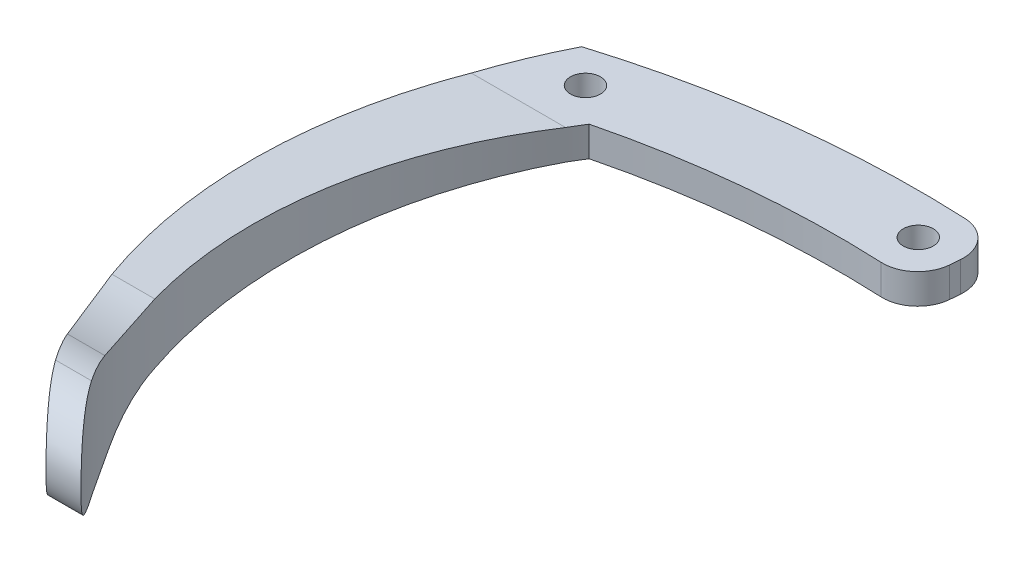
ISO-10303-21;
HEADER;
FILE_DESCRIPTION(('STEP AP214'),'2;1');
FILE_NAME('part.step','',(''),(''),'','','');
FILE_SCHEMA(('AUTOMOTIVE_DESIGN { 1 0 10303 214 1 1 1 1 }'));
ENDSEC;
DATA;
#1=APPLICATION_CONTEXT('core data for automotive mechanical design processes');
#2=APPLICATION_PROTOCOL_DEFINITION('international standard','automotive_design',2000,#1);
#3=PRODUCT_CONTEXT('',#1,'mechanical');
#4=PRODUCT('Part','Part','',(#3));
#5=PRODUCT_RELATED_PRODUCT_CATEGORY('part','',(#4));
#6=PRODUCT_DEFINITION_FORMATION('','',#4);
#7=PRODUCT_DEFINITION_CONTEXT('part definition',#1,'design');
#8=PRODUCT_DEFINITION('design','',#6,#7);
#9=PRODUCT_DEFINITION_SHAPE('','',#8);
#10=(LENGTH_UNIT() NAMED_UNIT(*) SI_UNIT(.MILLI.,.METRE.));
#11=(NAMED_UNIT(*) PLANE_ANGLE_UNIT() SI_UNIT($,.RADIAN.));
#12=(NAMED_UNIT(*) SI_UNIT($,.STERADIAN.) SOLID_ANGLE_UNIT());
#13=UNCERTAINTY_MEASURE_WITH_UNIT(LENGTH_MEASURE(1.E-05),#10,'distance_accuracy_value','');
#14=(GEOMETRIC_REPRESENTATION_CONTEXT(3) GLOBAL_UNCERTAINTY_ASSIGNED_CONTEXT((#13)) GLOBAL_UNIT_ASSIGNED_CONTEXT((#10,
#11,#12)) REPRESENTATION_CONTEXT('',''));
#15=CARTESIAN_POINT('',(0.,0.,0.));
#16=DIRECTION('',(0.,0.,1.));
#17=DIRECTION('',(1.,0.,0.));
#18=AXIS2_PLACEMENT_3D('',#15,#16,#17);
#19=CARTESIAN_POINT('',(33.3380804479992,10.,-0.314138112885189));
#20=DIRECTION('',(0.,-1.,0.));
#21=DIRECTION('',(0.,0.,-1.));
#22=AXIS2_PLACEMENT_3D('',#19,#20,#21);
#23=CYLINDRICAL_SURFACE('',#22,1.5);
#24=CARTESIAN_POINT('',(33.3380804479992,3.5,-0.314138112885189));
#25=DIRECTION('',(0.,1.,0.));
#26=DIRECTION('',(0.,0.,1.));
#27=AXIS2_PLACEMENT_3D('',#24,#25,#26);
#28=CIRCLE('',#27,1.5);
#29=CARTESIAN_POINT('',(33.3380804479992,3.5,1.18586188711481));
#30=VERTEX_POINT('',#29);
#31=EDGE_CURVE('E181',#30,#30,#28,.T.);
#32=ORIENTED_EDGE('',*,*,#31,.F.);
#33=EDGE_LOOP('',(#32));
#34=FACE_BOUND('',#33,.T.);
#35=CARTESIAN_POINT('',(33.3380804479992,6.5,-0.314138112885189));
#36=DIRECTION('',(0.,-1.,0.));
#37=DIRECTION('',(0.,0.,-1.));
#38=AXIS2_PLACEMENT_3D('',#35,#36,#37);
#39=CIRCLE('',#38,1.5);
#40=CARTESIAN_POINT('',(33.3380804479992,6.5,-1.81413811288519));
#41=VERTEX_POINT('',#40);
#42=EDGE_CURVE('E207',#41,#41,#39,.T.);
#43=ORIENTED_EDGE('',*,*,#42,.F.);
#44=EDGE_LOOP('',(#43));
#45=FACE_BOUND('',#44,.T.);
#46=ADVANCED_FACE('F43',(#34,#45),#23,.F.);
#47=CARTESIAN_POINT('',(-5.96136161269949,6.5,7.80214190070247));
#48=DIRECTION('',(0.,-1.,0.));
#49=DIRECTION('',(0.,0.,-1.));
#50=AXIS2_PLACEMENT_3D('',#47,#48,#49);
#51=PLANE('',#50);
#52=CARTESIAN_POINT('',(3.54066834664426,6.5,3.16641242719128));
#53=DIRECTION('',(0.,-1.,0.));
#54=DIRECTION('',(0.,0.,-1.));
#55=AXIS2_PLACEMENT_3D('',#52,#53,#54);
#56=CIRCLE('',#55,1.49999999999998);
#57=CARTESIAN_POINT('',(3.54066834664426,6.5,1.6664124271913));
#58=VERTEX_POINT('',#57);
#59=EDGE_CURVE('E202',#58,#58,#56,.T.);
#60=ORIENTED_EDGE('',*,*,#59,.T.);
#61=EDGE_LOOP('',(#60));
#62=FACE_BOUND('',#61,.T.);
#63=ORIENTED_EDGE('',*,*,#42,.T.);
#64=EDGE_LOOP('',(#63));
#65=FACE_BOUND('',#64,.T.);
#66=DIRECTION('',(1.,0.,0.));
#67=VECTOR('',#66,1.);
#68=CARTESIAN_POINT('',(-5.96136161269949,6.5,7.80214190070247));
#69=LINE('',#68,#67);
#70=CARTESIAN_POINT('',(-3.23491683360743,6.5,7.80214190070247));
#71=VERTEX_POINT('',#70);
#72=CARTESIAN_POINT('',(6.18628796721559,6.5,7.80214190070247));
#73=VERTEX_POINT('',#72);
#74=EDGE_CURVE('E176',#71,#73,#69,.T.);
#75=ORIENTED_EDGE('',*,*,#74,.T.);
#76=CARTESIAN_POINT('',(45.9119770796478,6.5,30.9941582973503));
#77=DIRECTION('',(0.,-1.,0.));
#78=DIRECTION('',(0.,0.,-1.));
#79=AXIS2_PLACEMENT_3D('',#76,#77,#78);
#80=CIRCLE('',#79,46.);
#81=CARTESIAN_POINT('',(7.08133669328854,6.5,6.33282485438257));
#82=VERTEX_POINT('',#81);
#83=EDGE_CURVE('E222',#82,#73,#80,.F.);
#84=ORIENTED_EDGE('',*,*,#83,.F.);
#85=CARTESIAN_POINT('',(29.3296857125669,6.5,95.6021419007025));
#86=DIRECTION('',(0.,-1.,0.));
#87=DIRECTION('',(0.,0.,-1.));
#88=AXIS2_PLACEMENT_3D('',#85,#86,#87);
#89=CIRCLE('',#88,92.);
#90=CARTESIAN_POINT('',(33.6351208335778,6.5,3.70294044378679));
#91=VERTEX_POINT('',#90);
#92=EDGE_CURVE('E218',#91,#82,#89,.F.);
#93=ORIENTED_EDGE('',*,*,#92,.F.);
#94=CARTESIAN_POINT('',(33.7989145610076,6.5,0.206775170969333));
#95=DIRECTION('',(0.,-1.,0.));
#96=DIRECTION('',(0.,0.,-1.));
#97=AXIS2_PLACEMENT_3D('',#94,#95,#96);
#98=CIRCLE('',#97,3.50000000000002);
#99=CARTESIAN_POINT('',(37.2867281700922,6.5,0.498590572010491));
#100=VERTEX_POINT('',#99);
#101=EDGE_CURVE('E214',#100,#91,#98,.T.);
#102=ORIENTED_EDGE('',*,*,#101,.F.);
#103=DIRECTION('',(-0.0833758288689002,0.,0.996518174024149));
#104=VECTOR('',#103,1.);
#105=CARTESIAN_POINT('',(37.3701594677668,6.5,-0.49859057201049));
#106=LINE('',#105,#104);
#107=CARTESIAN_POINT('',(37.3701594677668,6.5,-0.498590572010492));
#108=VERTEX_POINT('',#107);
#109=EDGE_CURVE('E210',#108,#100,#106,.T.);
#110=ORIENTED_EDGE('',*,*,#109,.F.);
#111=CARTESIAN_POINT('',(33.8823458586823,6.5,-0.79040597305165));
#112=DIRECTION('',(0.,-1.,0.));
#113=DIRECTION('',(0.,0.,-1.));
#114=AXIS2_PLACEMENT_3D('',#111,#112,#113);
#115=CIRCLE('',#114,3.49999999999999);
#116=CARTESIAN_POINT('',(34.0474682474015,6.5,-4.28650874567485));
#117=VERTEX_POINT('',#116);
#118=EDGE_CURVE('E206',#117,#108,#115,.T.);
#119=ORIENTED_EDGE('',*,*,#118,.F.);
#120=CARTESIAN_POINT('',(29.3296857125669,6.5,95.6021419007025));
#121=DIRECTION('',(0.,-1.,0.));
#122=DIRECTION('',(0.,0.,-1.));
#123=AXIS2_PLACEMENT_3D('',#120,#121,#122);
#124=CIRCLE('',#123,100.);
#125=CARTESIAN_POINT('',(0.,6.5,0.));
#126=VERTEX_POINT('',#125);
#127=EDGE_CURVE('E179',#126,#117,#124,.T.);
#128=ORIENTED_EDGE('',*,*,#127,.F.);
#129=CARTESIAN_POINT('',(49.0386383873005,6.5,24.9040547927356));
#130=DIRECTION('',(0.,-1.,0.));
#131=DIRECTION('',(0.,0.,-1.));
#132=AXIS2_PLACEMENT_3D('',#129,#130,#131);
#133=CIRCLE('',#132,55.);
#134=EDGE_CURVE('E163',#71,#126,#133,.T.);
#135=ORIENTED_EDGE('',*,*,#134,.F.);
#136=EDGE_LOOP('',(#75,#84,#93,#102,#110,#119,#128,#135));
#137=FACE_BOUND('',#136,.T.);
#138=ADVANCED_FACE('F175',(#62,#65,#137),#51,.F.);
#139=CARTESIAN_POINT('',(-5.96136161269949,32.9925159320674,45.29812586478));
#140=DIRECTION('',(1.,0.,0.));
#141=DIRECTION('',(0.,0.,-1.));
#142=AXIS2_PLACEMENT_3D('',#139,#140,#141);
#143=CYLINDRICAL_SURFACE('',#142,25.);
#144=DIRECTION('',(1.,0.,0.));
#145=VECTOR('',#144,1.);
#146=CARTESIAN_POINT('',(-5.96136161269949,9.35424864023339,53.4364499821773));
#147=LINE('',#146,#145);
#148=CARTESIAN_POINT('',(2.01840418165747,9.35424864023339,53.4364499821773));
#149=VERTEX_POINT('',#148);
#150=CARTESIAN_POINT('',(5.75797922223464,9.35424864023339,53.4364499821773));
#151=VERTEX_POINT('',#150);
#152=EDGE_CURVE('E195',#149,#151,#147,.T.);
#153=ORIENTED_EDGE('',*,*,#152,.T.);
#154=CARTESIAN_POINT('',(1.99704626542913,8.,44.6864499821773));
#155=CARTESIAN_POINT('',(2.11757982798963,7.99052733498026,45.0730833641365));
#156=CARTESIAN_POINT('',(2.24330110848355,7.99008647917682,45.4582900756178));
#157=CARTESIAN_POINT('',(2.50472598763776,8.00676018393478,46.2248564764888));
#158=CARTESIAN_POINT('',(2.64042807222505,8.02387208684709,46.606216739439));
#159=CARTESIAN_POINT('',(2.92022986019323,8.07491646643133,47.3609012003872));
#160=CARTESIAN_POINT('',(3.06424578703561,8.10870059968172,47.7342665043549));
#161=CARTESIAN_POINT('',(3.3612831929557,8.19244824812034,48.4755196219165));
#162=CARTESIAN_POINT('',(3.51430487586012,8.24241212961911,48.8434073112996));
#163=CARTESIAN_POINT('',(3.98614810063305,8.41569831691868,49.9376241527797));
#164=CARTESIAN_POINT('',(4.31789618819968,8.56244325083999,50.6549063251547));
#165=CARTESIAN_POINT('',(4.83954907571864,8.82640245582337,51.7115975056039));
#166=CARTESIAN_POINT('',(5.01830118768752,8.92222951670635,52.0621617951564));
#167=CARTESIAN_POINT('',(5.38291950798006,9.12788547390049,52.7553326500167));
#168=CARTESIAN_POINT('',(5.56878472078022,9.23771241581824,53.0979403181973));
#169=CARTESIAN_POINT('',(5.75797922223464,9.35424864023339,53.4364499821773));
#170=B_SPLINE_CURVE_WITH_KNOTS('',3,(#154,#155,#156,#157,#158,#159,#160,#161,#162,#163,#164,
#165,#166,#167,#168,#169),.UNSPECIFIED.,.F.,.F.,(4,2,2,2,2,2,2,4),(0.,1.21510951403613,
2.43003507646884,3.63434045295861,4.83867309690597,7.24606279532906,8.46078200779136,
9.67533182991223),.UNSPECIFIED.);
#171=CARTESIAN_POINT('',(1.99704626542912,8.,44.6864499821773));
#172=VERTEX_POINT('',#171);
#173=EDGE_CURVE('E278',#172,#151,#170,.T.);
#174=ORIENTED_EDGE('',*,*,#173,.F.);
#175=DIRECTION('',(1.,0.,0.));
#176=VECTOR('',#175,1.);
#177=CARTESIAN_POINT('',(-5.96136161269949,8.,44.6864499821773));
#178=LINE('',#177,#176);
#179=CARTESIAN_POINT('',(-2.2805280183296,8.,44.6864499821773));
#180=VERTEX_POINT('',#179);
#181=EDGE_CURVE('E188',#180,#172,#178,.T.);
#182=ORIENTED_EDGE('',*,*,#181,.F.);
#183=CARTESIAN_POINT('',(2.01840418165747,9.35424864023339,53.4364499821773));
#184=CARTESIAN_POINT('',(1.81244421606866,9.23740142887544,53.0970366055758));
#185=CARTESIAN_POINT('',(1.60915071193948,9.12737548588039,52.7537266394257));
#186=CARTESIAN_POINT('',(1.2083076647499,8.92148459130266,52.0595372392788));
#187=CARTESIAN_POINT('',(1.01075878311436,8.82562126523225,51.7086569416868));
#188=CARTESIAN_POINT('',(0.430564658266671,8.5615243443532,50.6508553300089));
#189=CARTESIAN_POINT('',(0.057023004999004,8.41487610433223,49.9332667741024));
#190=CARTESIAN_POINT('',(-0.481841509163625,8.24180161845979,48.8391306929205));
#191=CARTESIAN_POINT('',(-0.65792708426251,8.19192024924548,48.4713715675841));
#192=CARTESIAN_POINT('',(-1.00255461513615,8.10833304516076,47.7304825810023));
#193=CARTESIAN_POINT('',(-1.17109674783433,8.07462683073882,47.3573528459905));
#194=CARTESIAN_POINT('',(-1.50148717059436,8.02373944313895,46.6035095390079));
#195=CARTESIAN_POINT('',(-1.66327239948215,8.00669030321767,46.2227594034342));
#196=CARTESIAN_POINT('',(-1.97836366344166,7.99009000193058,45.4573309239441));
#197=CARTESIAN_POINT('',(-2.13166851843536,7.99054126971343,45.0726520421057));
#198=CARTESIAN_POINT('',(-2.28052801832959,8.,44.6864499821773));
#199=B_SPLINE_CURVE_WITH_KNOTS('',3,(#183,#184,#185,#186,#187,#188,#189,#190,#191,#192,#193,
#194,#195,#196,#197,#198),.UNSPECIFIED.,.F.,.F.,(4,2,2,2,2,2,2,4),(0.,1.24135015658934,
2.48284267845914,4.94572315237709,6.17774069119646,7.40972931919352,8.65140600640679,
9.89325504549251),.UNSPECIFIED.);
#200=EDGE_CURVE('E165',#149,#180,#199,.T.);
#201=ORIENTED_EDGE('',*,*,#200,.F.);
#202=EDGE_LOOP('',(#153,#174,#182,#201));
#203=FACE_BOUND('',#202,.T.);
#204=ADVANCED_FACE('F265',(#203),#143,.F.);
#205=CARTESIAN_POINT('',(-5.96136161269949,8.,44.6864499821773));
#206=DIRECTION('',(0.,-0.999174093372173,0.0406341129335435));
#207=DIRECTION('',(0.,-0.0406341129335435,-0.999174093372173));
#208=AXIS2_PLACEMENT_3D('',#205,#206,#207);
#209=PLANE('',#208);
#210=ORIENTED_EDGE('',*,*,#181,.T.);
#211=CARTESIAN_POINT('',(45.9119770796478,7.44316598045238,30.9941582973503));
#212=DIRECTION('',(0.,-0.999174093372173,0.0406341129335435));
#213=DIRECTION('',(0.,-0.0406341129335435,-0.999174093372173));
#214=AXIS2_PLACEMENT_3D('',#211,#212,#213);
#215=ELLIPSE('',#214,46.0380231084173,46.);
#216=EDGE_CURVE('E185',#73,#172,#215,.F.);
#217=ORIENTED_EDGE('',*,*,#216,.F.);
#218=ORIENTED_EDGE('',*,*,#74,.F.);
#219=CARTESIAN_POINT('',(49.0386383873005,7.19549547415623,24.9040547927356));
#220=DIRECTION('',(0.,-0.999174093372173,0.0406341129335435));
#221=DIRECTION('',(0.,-0.0406341129335435,-0.999174093372173));
#222=AXIS2_PLACEMENT_3D('',#219,#220,#221);
#223=ELLIPSE('',#222,55.0454624122381,55.);
#224=EDGE_CURVE('E158',#180,#71,#223,.T.);
#225=ORIENTED_EDGE('',*,*,#224,.F.);
#226=EDGE_LOOP('',(#210,#217,#218,#225));
#227=FACE_BOUND('',#226,.T.);
#228=ADVANCED_FACE('F183',(#227),#209,.F.);
#229=CARTESIAN_POINT('',(-5.96136161269949,5.,56.9364499821773));
#230=DIRECTION('',(-1.,0.,0.));
#231=DIRECTION('',(0.,-1.,0.));
#232=AXIS2_PLACEMENT_3D('',#229,#230,#231);
#233=ELLIPSE('',#232,5.,5.);
#234=DIRECTION('',(1.,0.,0.));
#235=VECTOR('',#234,1.);
#236=SURFACE_OF_LINEAR_EXTRUSION('',#233,#235);
#237=DIRECTION('',(1.,0.,0.));
#238=VECTOR('',#237,1.);
#239=CARTESIAN_POINT('',(-5.96136161269949,0.,56.9364499821773));
#240=LINE('',#239,#238);
#241=CARTESIAN_POINT('',(4.32929195473193,0.,56.9364499821773));
#242=VERTEX_POINT('',#241);
#243=CARTESIAN_POINT('',(7.92517013119065,0.,56.9364499821773));
#244=VERTEX_POINT('',#243);
#245=EDGE_CURVE('E375',#242,#244,#240,.T.);
#246=ORIENTED_EDGE('',*,*,#245,.T.);
#247=CARTESIAN_POINT('',(7.92517013119065,10.,56.9364499821773));
#248=CARTESIAN_POINT('',(8.04324251136591,9.99998389080116,57.1093644497903));
#249=CARTESIAN_POINT('',(8.16249419721657,9.99103002788204,57.2814245979212));
#250=CARTESIAN_POINT('',(8.4024519722676,9.95565764327807,57.6226903603597));
#251=CARTESIAN_POINT('',(8.52315790854248,9.92924094247451,57.7918962703976));
#252=CARTESIAN_POINT('',(8.76417411569704,9.85963394482865,58.1250023818342));
#253=CARTESIAN_POINT('',(8.88447978979712,9.81657994012911,58.2889342619854));
#254=CARTESIAN_POINT('',(9.12465868006752,9.71401574789513,58.6117942697585));
#255=CARTESIAN_POINT('',(9.24453188245581,9.65450504052913,58.7707222391412));
#256=CARTESIAN_POINT('',(9.59298769009579,9.45666342277107,59.2266317723918));
#257=CARTESIAN_POINT('',(9.81994726584854,9.29623585160323,59.515864506615));
#258=CARTESIAN_POINT('',(10.1397040238752,9.01944142447278,59.9142277079782));
#259=CARTESIAN_POINT('',(10.2382685218729,8.92664142197093,60.0356779437011));
#260=CARTESIAN_POINT('',(10.4314693527165,8.72851371097535,60.2713963959884));
#261=CARTESIAN_POINT('',(10.5261058369209,8.62318648579952,60.3856648893748));
#262=CARTESIAN_POINT('',(10.6989850147225,8.413555667027,60.5924880495861));
#263=CARTESIAN_POINT('',(10.7778232847499,8.31067966930209,60.6859947994317));
#264=CARTESIAN_POINT('',(10.9304557684081,8.09530308821907,60.8656671045452));
#265=CARTESIAN_POINT('',(11.00425279574,7.98280795392267,60.9518367616411));
#266=CARTESIAN_POINT('',(11.1365423080245,7.76344085748269,61.105253224625));
#267=CARTESIAN_POINT('',(11.1957799854616,7.65772200879059,61.1735062086565));
#268=CARTESIAN_POINT('',(11.3088159500144,7.43905916661069,61.3030454028363));
#269=CARTESIAN_POINT('',(11.362606528477,7.32610529306865,61.3643217545843));
#270=CARTESIAN_POINT('',(11.4584912016972,7.10544824058921,61.4730364553406));
#271=CARTESIAN_POINT('',(11.5012193901104,6.998403157277,61.5212500774978));
#272=CARTESIAN_POINT('',(11.5807333373039,6.77929482001804,61.610645404457));
#273=CARTESIAN_POINT('',(11.6175203938948,6.66723266887475,61.6518286451235));
#274=CARTESIAN_POINT('',(11.6843991087569,6.43877138479366,61.7264770887543));
#275=CARTESIAN_POINT('',(11.7144986924796,6.32237757853783,61.7599514294208));
#276=CARTESIAN_POINT('',(11.7673658322869,6.08595228132477,61.818614266746));
#277=CARTESIAN_POINT('',(11.7901377695892,5.96592301117163,61.8438077147648));
#278=CARTESIAN_POINT('',(11.8267125503248,5.73014820681977,61.884212381291));
#279=CARTESIAN_POINT('',(11.8409575348624,5.61455577606417,61.8999161876856));
#280=CARTESIAN_POINT('',(11.8621062856737,5.3818869000851,61.9232150299612));
#281=CARTESIAN_POINT('',(11.8690105992457,5.26481056615567,61.9308106703627));
#282=CARTESIAN_POINT('',(11.8749573926249,5.04319715635824,61.9373530864237));
#283=CARTESIAN_POINT('',(11.8747847784868,4.93870502803128,61.9371633415182));
#284=CARTESIAN_POINT('',(11.8685016075017,4.7300964723038,61.9302504956347));
#285=CARTESIAN_POINT('',(11.8623900434762,4.62598011163529,61.9235262864858));
#286=CARTESIAN_POINT('',(11.8443401247976,4.41876744927536,61.9036437561412));
#287=CARTESIAN_POINT('',(11.8323957229018,4.31567231977949,61.8904787573776));
#288=CARTESIAN_POINT('',(11.8029024244317,4.11123749442155,61.8579154868959));
#289=CARTESIAN_POINT('',(11.7853506902844,4.00989871478696,61.8385140592217));
#290=CARTESIAN_POINT('',(11.7447592925603,3.80862553107215,61.7935438855956));
#291=CARTESIAN_POINT('',(11.7216670387144,3.70871494926325,61.7679160072127));
#292=CARTESIAN_POINT('',(11.6704822365339,3.51183333496978,61.7109533603703));
#293=CARTESIAN_POINT('',(11.6423875287728,3.41486359320883,61.6796161271978));
#294=CARTESIAN_POINT('',(11.5512050030561,3.12896087362051,61.5775793897384));
#295=CARTESIAN_POINT('',(11.4812026608155,2.94495681649378,61.4988371165716));
#296=CARTESIAN_POINT('',(11.3768098465771,2.70739420304388,61.3804036416555));
#297=CARTESIAN_POINT('',(11.3488376629806,2.64676818038879,61.3485864400676));
#298=CARTESIAN_POINT('',(11.2912429625639,2.52751835264453,61.2828801624821));
#299=CARTESIAN_POINT('',(11.2616219658171,2.46889278118467,61.2489929921115));
#300=CARTESIAN_POINT('',(11.1704868267895,2.2960674622976,61.144405735239));
#301=CARTESIAN_POINT('',(11.106676623981,2.18486517847957,61.0707528329461));
#302=CARTESIAN_POINT('',(10.9077297523659,1.86379546774371,60.8394888207718));
#303=CARTESIAN_POINT('',(10.7648992179086,1.66607450315012,60.6713725679809));
#304=CARTESIAN_POINT('',(10.51993356415,1.36952292255404,60.3782621297815));
#305=CARTESIAN_POINT('',(10.4217574387327,1.26078556709729,60.2596553575404));
#306=CARTESIAN_POINT('',(10.2211899565198,1.05669183758356,60.0147168257223));
#307=CARTESIAN_POINT('',(10.1187978670728,0.961337802085205,59.888383721594));
#308=CARTESIAN_POINT('',(9.80726589257538,0.695489038769469,59.4995863110808));
#309=CARTESIAN_POINT('',(9.59344427188616,0.54482304132434,59.2269364095834));
#310=CARTESIAN_POINT('',(9.25843691699294,0.352771566980075,58.7890639542351));
#311=CARTESIAN_POINT('',(9.13870938308477,0.292679197513408,58.6304970397098));
#312=CARTESIAN_POINT('',(8.89877953563765,0.188909706206604,58.3083204379304));
#313=CARTESIAN_POINT('',(8.77857718432187,0.145233918190404,58.1447103420931));
#314=CARTESIAN_POINT('',(8.53520525773033,0.0735909882577781,57.8087277897683));
#315=CARTESIAN_POINT('',(8.41205116664201,0.046118142583302,57.6362389031591));
#316=CARTESIAN_POINT('',(8.16724486317772,0.00933061423657005,57.288279132595));
#317=CARTESIAN_POINT('',(8.04559271466882,1.67011119754214E-05,57.1128081225801));
#318=CARTESIAN_POINT('',(7.92517013119062,0.,56.9364499821774));
#319=B_SPLINE_CURVE_WITH_KNOTS('',3,(#247,#248,#249,#250,#251,#252,#253,#254,#255,#256,#257,
#258,#259,#260,#261,#262,#263,#264,#265,#266,#267,#268,#269,#270,#271,#272,#273,#274,#275,#276,
#277,#278,#279,#280,#281,#282,#283,#284,#285,#286,#287,#288,#289,#290,#291,#292,#293,#294,#295,
#296,#297,#298,#299,#300,#301,#302,#303,#304,#305,#306,#307,#308,#309,#310,#311,#312,#313,#314,
#315,#316,#317,#318),.UNSPECIFIED.,.F.,.F.,(4,2,2,2,2,2,2,2,2,2,2,2,2,2,2,2,2,2,2,2,2,2,2,2,2,2,
2,2,2,2,2,2,2,2,2,4),(0.,0.627885924568651,1.25570638867561,1.87848922210628,2.50129173014406,
3.69804529691198,4.24321870399245,4.78837108433358,5.26735181894208,5.74606299501626,
6.16288822344051,6.58029532657205,6.95469584372516,7.32901446399176,7.70288707739188,
8.07653573429305,8.42859900317824,8.78063602144865,9.09374645424961,9.40690999629473,
9.72039890474412,10.0340467052372,10.3507983994491,10.6676871599103,11.3012234126369,
11.5230753366544,11.7447260136247,12.1878333893047,13.0726451401979,13.6375271635232,
14.2025077699706,15.330583513365,15.952777639664,16.5750223074308,17.2153807573625,
17.8557663441116),.UNSPECIFIED.);
#320=CARTESIAN_POINT('',(7.92517013119065,10.,56.9364499821773));
#321=VERTEX_POINT('',#320);
#322=EDGE_CURVE('E65',#321,#244,#319,.T.);
#323=ORIENTED_EDGE('',*,*,#322,.F.);
#324=DIRECTION('',(1.,0.,0.));
#325=VECTOR('',#324,1.);
#326=CARTESIAN_POINT('',(-5.96136161269949,10.,56.9364499821773));
#327=LINE('',#326,#325);
#328=CARTESIAN_POINT('',(4.32929195473193,10.,56.9364499821773));
#329=VERTEX_POINT('',#328);
#330=EDGE_CURVE('E372',#329,#321,#327,.T.);
#331=ORIENTED_EDGE('',*,*,#330,.F.);
#332=CARTESIAN_POINT('',(4.32929195473193,0.,56.9364499821773));
#333=CARTESIAN_POINT('',(4.45118355812813,1.74759810750943E-05,57.1065985094802));
#334=CARTESIAN_POINT('',(4.57404388171993,0.0086856386714837,57.276012284111));
#335=CARTESIAN_POINT('',(4.82084739281029,0.0430023938008243,57.612313204685));
#336=CARTESIAN_POINT('',(4.94479056824069,0.0686507972361945,57.7792003787302));
#337=CARTESIAN_POINT('',(5.19289533973124,0.136603648877599,58.1093780171484));
#338=CARTESIAN_POINT('',(5.31705691229321,0.17890640270188,58.2726688456227));
#339=CARTESIAN_POINT('',(5.56462391188655,0.279925966684737,58.5945791689768));
#340=CARTESIAN_POINT('',(5.68802932209605,0.338643140659449,58.7531985602309));
#341=CARTESIAN_POINT('',(6.04768970602091,0.53495184704871,59.210385519878));
#342=CARTESIAN_POINT('',(6.28188371965044,0.695039689239671,59.5015459046366));
#343=CARTESIAN_POINT('',(6.61029172679222,0.971602654103106,59.9020797778667));
#344=CARTESIAN_POINT('',(6.71083459070728,1.0638451745909,60.0235760962533));
#345=CARTESIAN_POINT('',(6.90777856290622,1.26097155927332,60.2595938962104));
#346=CARTESIAN_POINT('',(7.00417987177427,1.3658548103126,60.3741157156829));
#347=CARTESIAN_POINT('',(7.1798663078369,1.57442535071136,60.5812086756236));
#348=CARTESIAN_POINT('',(7.25978675770098,1.67663077427477,60.674736225743));
#349=CARTESIAN_POINT('',(7.41446642423626,1.89073022643512,60.8546090965989));
#350=CARTESIAN_POINT('',(7.48922852585791,2.00261875923552,60.9409584375769));
#351=CARTESIAN_POINT('',(7.62317325455177,2.22083501743743,61.0947754687515));
#352=CARTESIAN_POINT('',(7.68311756197219,2.32599368448232,61.1632383107184));
#353=CARTESIAN_POINT('',(7.797512874318,2.54358973149431,61.2932987434378));
#354=CARTESIAN_POINT('',(7.8519560990294,2.65603706112296,61.3548866234309));
#355=CARTESIAN_POINT('',(7.94905427386058,2.87582085525755,61.4642909493537));
#356=CARTESIAN_POINT('',(7.9923456968828,2.98249482743613,61.5128722209463));
#357=CARTESIAN_POINT('',(8.0729621310395,3.20091725055692,61.603060613423));
#358=CARTESIAN_POINT('',(8.11028844052723,3.31266459042322,61.644669252051));
#359=CARTESIAN_POINT('',(8.17823162410101,3.54055744904942,61.7202161996285));
#360=CARTESIAN_POINT('',(8.2088564181845,3.65669758374269,61.7541635643423));
#361=CARTESIAN_POINT('',(8.26276833123415,3.89268110091214,61.8138101583965));
#362=CARTESIAN_POINT('',(8.28605983128716,4.01252222515174,61.8395143126009));
#363=CARTESIAN_POINT('',(8.32364458310271,4.24801530361378,61.8809396846534));
#364=CARTESIAN_POINT('',(8.3383791434018,4.3635105155646,61.897150956364));
#365=CARTESIAN_POINT('',(8.3605019961569,4.59605260076357,61.9214762861672));
#366=CARTESIAN_POINT('',(8.36789078754317,4.71309936808161,61.9295908941916));
#367=CARTESIAN_POINT('',(8.37473578846426,4.93455041262452,61.9371081899986));
#368=CARTESIAN_POINT('',(8.3749879342404,5.03890204185763,61.9373850121844));
#369=CARTESIAN_POINT('',(8.36955533318956,5.24728337257135,61.931419008747));
#370=CARTESIAN_POINT('',(8.36386960083599,5.35131301773673,61.9251751008597));
#371=CARTESIAN_POINT('',(8.3466613902231,5.55840303545036,61.9062597314132));
#372=CARTESIAN_POINT('',(8.33513296946235,5.66146231213514,61.893581725822));
#373=CARTESIAN_POINT('',(8.30644806031786,5.86587476858801,61.8619920390481));
#374=CARTESIAN_POINT('',(8.28928867438914,5.96722704168923,61.843077148506));
#375=CARTESIAN_POINT('',(8.24946452482549,6.16848634940113,61.7990975639262));
#376=CARTESIAN_POINT('',(8.22675120835906,6.26837191856972,61.773978612914));
#377=CARTESIAN_POINT('',(8.17628135994802,6.46524050598061,61.718035818415));
#378=CARTESIAN_POINT('',(8.14852264475805,6.56222224643483,61.6872095051298));
#379=CARTESIAN_POINT('',(8.05826511909854,6.84819922325622,61.5867087260766));
#380=CARTESIAN_POINT('',(7.9887681389976,7.03230862347782,61.5089939937339));
#381=CARTESIAN_POINT('',(7.88502095008023,7.26966781307909,61.3921542800686));
#382=CARTESIAN_POINT('',(7.85732827948867,7.32998230917203,61.3608999463391));
#383=CARTESIAN_POINT('',(7.80027418619674,7.44863581053165,61.296350243698));
#384=CARTESIAN_POINT('',(7.77091429974463,7.50697655785179,61.2630567516052));
#385=CARTESIAN_POINT('',(7.68052912419138,7.67898512602967,61.1602974898925));
#386=CARTESIAN_POINT('',(7.61717440392122,7.78969351439121,61.0879260496889));
#387=CARTESIAN_POINT('',(7.41941933302067,8.1094228221156,60.8607045462436));
#388=CARTESIAN_POINT('',(7.27715207652478,8.30643740665474,60.69555045049));
#389=CARTESIAN_POINT('',(7.03177683879634,8.60318399613585,60.4068118530498));
#390=CARTESIAN_POINT('',(6.93275886711546,8.71257953171513,60.2893599472954));
#391=CARTESIAN_POINT('',(6.73016457791144,8.91796805386512,60.0468784377495));
#392=CARTESIAN_POINT('',(6.62658731770607,9.01395825145535,59.9218472648281));
#393=CARTESIAN_POINT('',(6.31101095412697,9.2817358698913,59.5372631281942));
#394=CARTESIAN_POINT('',(6.09382198285551,9.43373694771118,59.2678155287565));
#395=CARTESIAN_POINT('',(5.76384754348503,9.62188772427402,58.8499576335165));
#396=CARTESIAN_POINT('',(5.65314057345763,9.67796828783162,58.7083682247034));
#397=CARTESIAN_POINT('',(5.43089612786216,9.77688433832556,58.4211806022139));
#398=CARTESIAN_POINT('',(5.31935856750988,9.81971845358548,58.2755819750797));
#399=CARTESIAN_POINT('',(5.06059286338711,9.90351742765994,57.9342031561842));
#400=CARTESIAN_POINT('',(4.91332354491561,9.939532134615,57.7372240199129));
#401=CARTESIAN_POINT('',(4.62000108055797,9.98776562580777,57.3393200384601));
#402=CARTESIAN_POINT('',(4.47394864913388,9.99997129378585,57.1383930799703));
#403=CARTESIAN_POINT('',(4.32929195473192,10.,56.9364499821774));
#404=B_SPLINE_CURVE_WITH_KNOTS('',3,(#332,#333,#334,#335,#336,#337,#338,#339,#340,#341,#342,
#343,#344,#345,#346,#347,#348,#349,#350,#351,#352,#353,#354,#355,#356,#357,#358,#359,#360,#361,
#362,#363,#364,#365,#366,#367,#368,#369,#370,#371,#372,#373,#374,#375,#376,#377,#378,#379,#380,
#381,#382,#383,#384,#385,#386,#387,#388,#389,#390,#391,#392,#393,#394,#395,#396,#397,#398,#399,
#400,#401,#402,#403),.UNSPECIFIED.,.F.,.F.,(4,2,2,2,2,2,2,2,2,2,2,2,2,2,2,2,2,2,2,2,2,2,2,2,2,2,
2,2,2,2,2,2,2,2,2,4),(0.,0.627677271311578,1.25534755619421,1.88295399959793,2.5105743546388,
3.72337166601852,4.27102875151494,4.81865928286344,5.29799900960177,5.77706844192252,
6.19383753355915,6.61118804781536,6.98564503814817,7.36002041367682,7.73395092560562,
8.10765761665804,8.45982193155569,8.81196232554859,9.12465334253941,9.43739626600067,
9.75045791536826,10.0636809112079,10.3797466892192,10.695949562267,11.3280995178494,
11.5481449125436,11.7679907377463,12.2074878665278,13.0850875014294,13.6502570262338,
14.2155439599386,15.3441336164554,15.9085985364158,16.4731218874466,17.2176318117569,
17.9625517665063),.UNSPECIFIED.);
#405=EDGE_CURVE('E73',#242,#329,#404,.T.);
#406=ORIENTED_EDGE('',*,*,#405,.F.);
#407=EDGE_LOOP('',(#246,#323,#331,#406));
#408=FACE_BOUND('',#407,.T.);
#409=ADVANCED_FACE('F364',(#408),#236,.F.);
#410=CARTESIAN_POINT('',(-5.96136161269949,5.,56.9364499821773));
#411=DIRECTION('',(-1.,0.,0.));
#412=DIRECTION('',(0.,-0.0665976990169038,-0.997779908840449));
#413=AXIS2_PLACEMENT_3D('',#410,#411,#412);
#414=ELLIPSE('',#413,8.01780024744842,4.99320763667066);
#415=DIRECTION('',(1.,0.,0.));
#416=VECTOR('',#415,1.);
#417=SURFACE_OF_LINEAR_EXTRUSION('',#414,#416);
#418=ORIENTED_EDGE('',*,*,#330,.T.);
#419=CARTESIAN_POINT('',(5.75797922223464,9.35424864023339,53.4364499821773));
#420=CARTESIAN_POINT('',(5.82338382965421,9.39453387660516,53.5534747671314));
#421=CARTESIAN_POINT('',(5.88960686544496,9.43271582580431,53.6707584634929));
#422=CARTESIAN_POINT('',(6.0234116985749,9.504917337635,53.9053017980977));
#423=CARTESIAN_POINT('',(6.09098849617081,9.5389497708158,54.0225603230896));
#424=CARTESIAN_POINT('',(6.22748803529115,9.6030794918682,54.2569976378494));
#425=CARTESIAN_POINT('',(6.29640744308387,9.63318537720101,54.3741760233274));
#426=CARTESIAN_POINT('',(6.43558436377669,9.68964714160518,54.6084114060315));
#427=CARTESIAN_POINT('',(6.50583989266734,9.7160081531623,54.725468346801));
#428=CARTESIAN_POINT('',(6.64768359308809,9.76513557902915,54.9594239913013));
#429=CARTESIAN_POINT('',(6.7192709005289,9.78790423905132,55.0763227482354));
#430=CARTESIAN_POINT('',(6.86374614451226,9.82996704116069,55.3098838778034));
#431=CARTESIAN_POINT('',(6.93663362826658,9.84926236784459,55.4265463175615));
#432=CARTESIAN_POINT('',(7.08374692147591,9.88449779177946,55.6596717964118));
#433=CARTESIAN_POINT('',(7.15797380295722,9.9004350590787,55.7761345859304));
#434=CARTESIAN_POINT('',(7.30777355339313,9.92903895561856,56.008846960148));
#435=CARTESIAN_POINT('',(7.38334829214237,9.9417005903288,56.1250959540329));
#436=CARTESIAN_POINT('',(7.53585256534671,9.96381885386926,56.3573680209678));
#437=CARTESIAN_POINT('',(7.61278466366423,9.97326853215537,56.473390070648));
#438=CARTESIAN_POINT('',(7.76801368112522,9.98900767517775,56.7051983472904));
#439=CARTESIAN_POINT('',(7.846313775854,9.99528836378078,56.8209830444896));
#440=CARTESIAN_POINT('',(7.92517013119066,10.,56.9364499821773));
#441=B_SPLINE_CURVE_WITH_KNOTS('',3,(#419,#420,#421,#422,#423,#424,#425,#426,#427,#428,#429,
#430,#431,#432,#433,#434,#435,#436,#437,#438,#439,#440),.UNSPECIFIED.,.F.,.F.,(4,2,2,2,2,2,2,2,
2,2,4),(0.,0.419923507387954,0.838509486153782,1.25616297772969,1.67323842051788,
2.09005209196464,2.50672333668986,2.92374433240335,3.34139748359144,3.75994874961481,
4.17965286659553),.UNSPECIFIED.);
#442=EDGE_CURVE('E301',#151,#321,#441,.T.);
#443=ORIENTED_EDGE('',*,*,#442,.F.);
#444=ORIENTED_EDGE('',*,*,#152,.F.);
#445=CARTESIAN_POINT('',(4.32929195473249,10.,56.9364499821781));
#446=CARTESIAN_POINT('',(4.24639899188523,9.99527886035125,56.8207525371545));
#447=CARTESIAN_POINT('',(4.16398539160889,9.98898413622232,56.7047741021666));
#448=CARTESIAN_POINT('',(4.00037239672159,9.97321137969311,56.4726261497388));
#449=CARTESIAN_POINT('',(3.91917042752601,9.9637415635039,56.3564578878241));
#450=CARTESIAN_POINT('',(3.75797181809539,9.94158104119675,56.12393965022));
#451=CARTESIAN_POINT('',(3.67797308683109,9.92889683391671,56.0075905064394));
#452=CARTESIAN_POINT('',(3.51917317354099,9.90024904012333,55.774722403959));
#453=CARTESIAN_POINT('',(3.44037045678447,9.88429012060508,55.6582039186966));
#454=CARTESIAN_POINT('',(3.28395568030415,9.84901580040453,55.4250099900834));
#455=CARTESIAN_POINT('',(3.20634273430407,9.82970304493525,55.3083347418007));
#456=CARTESIAN_POINT('',(3.0522688154551,9.78761338355155,55.0747921059914));
#457=CARTESIAN_POINT('',(2.97580822306763,9.76483535993662,54.9579246685496));
#458=CARTESIAN_POINT('',(2.82407268902339,9.71569988173864,54.7240708175322));
#459=CARTESIAN_POINT('',(2.74879846835726,9.68934033758959,54.6070843743676));
#460=CARTESIAN_POINT('',(2.5994415625771,9.63289507602409,54.3730265684032));
#461=CARTESIAN_POINT('',(2.52536054604105,9.6028045792586,54.255955291712));
#462=CARTESIAN_POINT('',(2.37839797475618,9.53872216663627,54.0217660272005));
#463=CARTESIAN_POINT('',(2.30551924709424,9.50472223671312,53.9046484521416));
#464=CARTESIAN_POINT('',(2.16097427848734,9.43260483807454,53.6704176035079));
#465=CARTESIAN_POINT('',(2.08931231792832,9.39447535355247,53.5533053913373));
#466=CARTESIAN_POINT('',(2.01840418165747,9.35424864023339,53.4364499821773));
#467=B_SPLINE_CURVE_WITH_KNOTS('',3,(#445,#446,#447,#448,#449,#450,#451,#452,#453,#454,#455,
#456,#457,#458,#459,#460,#461,#462,#463,#464,#465,#466),.UNSPECIFIED.,.F.,.F.,(4,2,2,2,2,2,2,2,
2,2,4),(0.,0.427209910800706,0.853322751320526,1.2785808584092,1.70323706149467,
2.12755984151782,2.55201977550553,2.97672842405989,3.40198685670924,3.8281331264874,
4.25555448035591),.UNSPECIFIED.);
#468=EDGE_CURVE('E358',#329,#149,#467,.T.);
#469=ORIENTED_EDGE('',*,*,#468,.F.);
#470=EDGE_LOOP('',(#418,#443,#444,#469));
#471=FACE_BOUND('',#470,.T.);
#472=ADVANCED_FACE('F272',(#471),#417,.F.);
#473=CARTESIAN_POINT('',(-5.96136161269949,5.,56.9364499821773));
#474=DIRECTION('',(-1.,0.,0.));
#475=DIRECTION('',(0.,-0.0665976990169038,-0.997779908840449));
#476=AXIS2_PLACEMENT_3D('',#473,#474,#475);
#477=ELLIPSE('',#476,8.01780024744842,4.99320763667066);
#478=DIRECTION('',(1.,0.,0.));
#479=VECTOR('',#478,1.);
#480=SURFACE_OF_LINEAR_EXTRUSION('',#477,#479);
#481=DIRECTION('',(1.,0.,0.));
#482=VECTOR('',#481,1.);
#483=CARTESIAN_POINT('',(-5.96136161269949,0.590934971061326,52.6813177026645));
#484=LINE('',#483,#482);
#485=CARTESIAN_POINT('',(1.56839860243439,0.590934971061326,52.6813177026645));
#486=VERTEX_POINT('',#485);
#487=CARTESIAN_POINT('',(5.34515421996989,0.590934971061326,52.6813177026645));
#488=VERTEX_POINT('',#487);
#489=EDGE_CURVE('E378',#486,#488,#484,.T.);
#490=ORIENTED_EDGE('',*,*,#489,.T.);
#491=CARTESIAN_POINT('',(7.23442047747921,-2.82412981889024E-12,55.894893533203));
#492=CARTESIAN_POINT('',(7.09374836504098,0.00902334340288712,55.6764086184805));
#493=CARTESIAN_POINT('',(6.95501581730008,0.0237540765098533,55.4568357518511));
#494=CARTESIAN_POINT('',(6.68231350210474,0.065459685443896,55.0170632235031));
#495=CARTESIAN_POINT('',(6.54832776413781,0.0923882359494423,54.7968690373582));
#496=CARTESIAN_POINT('',(6.3224645193518,0.149829535633692,54.418596012219));
#497=CARTESIAN_POINT('',(6.22946755558773,0.177134402365752,54.2606966067666));
#498=CARTESIAN_POINT('',(6.04596199580064,0.238883053450204,53.9448487311858));
#499=CARTESIAN_POINT('',(5.95545328868055,0.273326518486225,53.7869002635675));
#500=CARTESIAN_POINT('',(5.77661130121589,0.350034043224253,53.4704921534913));
#501=CARTESIAN_POINT('',(5.68829224002594,0.392338933628778,53.3120342933929));
#502=CARTESIAN_POINT('',(5.51451652695773,0.485256610283871,52.9959271070215));
#503=CARTESIAN_POINT('',(5.42906074740398,0.535871901154526,52.8382780393223));
#504=CARTESIAN_POINT('',(5.34515421996989,0.590934971061326,52.6813177026645));
#505=B_SPLINE_CURVE_WITH_KNOTS('',3,(#491,#492,#493,#494,#495,#496,#497,#498,#499,#500,#501,
#502,#503,#504),.UNSPECIFIED.,.F.,.F.,(4,2,2,2,2,2,4),(0.,0.780061940143108,1.55718585400913,
2.11286580796751,2.66852091118941,3.22714700797158,3.78594177570072),.UNSPECIFIED.);
#506=CARTESIAN_POINT('',(7.23442047747921,-2.82412981889024E-12,55.894893533203));
#507=VERTEX_POINT('',#506);
#508=EDGE_CURVE('E11',#507,#488,#505,.T.);
#509=ORIENTED_EDGE('',*,*,#508,.F.);
#510=DIRECTION('',(1.,0.,0.));
#511=VECTOR('',#510,1.);
#512=CARTESIAN_POINT('',(-5.96136161269949,0.,55.8948935330656));
#513=LINE('',#512,#511);
#514=CARTESIAN_POINT('',(3.60112179395155,0.,55.8948935330656));
#515=VERTEX_POINT('',#514);
#516=EDGE_CURVE('E341',#507,#515,#513,.F.);
#517=ORIENTED_EDGE('',*,*,#516,.T.);
#518=CARTESIAN_POINT('',(1.56839860243439,0.590934971061326,52.6813177026645));
#519=CARTESIAN_POINT('',(1.6313174026517,0.553201767939744,52.7888445556292));
#520=CARTESIAN_POINT('',(1.6949152226731,0.517569860184275,52.896691270487));
#521=CARTESIAN_POINT('',(1.82338750798396,0.450300262418443,53.1128455901051));
#522=CARTESIAN_POINT('',(1.88826176845041,0.418661937526185,53.22115311877));
#523=CARTESIAN_POINT('',(2.08422224768603,0.329628405259793,53.5457464416229));
#524=CARTESIAN_POINT('',(2.21711347599635,0.277838315817968,53.762502140472));
#525=CARTESIAN_POINT('',(2.45168274806878,0.199728898777674,54.1391547105464));
#526=CARTESIAN_POINT('',(2.55238962116761,0.170292497479189,54.2990299838957));
#527=CARTESIAN_POINT('',(2.7559815322697,0.118395733838291,54.6185555749783));
#528=CARTESIAN_POINT('',(2.85886681215473,0.0959361505595335,54.778205865609));
#529=CARTESIAN_POINT('',(3.06721823210597,0.0575140247549712,55.0978474475539));
#530=CARTESIAN_POINT('',(3.17269538885692,0.0415875903094701,55.2578358486431));
#531=CARTESIAN_POINT('',(3.38552715936586,0.0161005022594139,55.5770114301186));
#532=CARTESIAN_POINT('',(3.49288128157699,0.00653820687634387,55.7361988066231));
#533=CARTESIAN_POINT('',(3.60112179395157,0.,55.8948935330656));
#534=B_SPLINE_CURVE_WITH_KNOTS('',3,(#518,#519,#520,#521,#522,#523,#524,#525,#526,#527,#528,
#529,#530,#531,#532,#533),.UNSPECIFIED.,.F.,.F.,(4,2,2,2,2,2,2,4),(0.,0.390466463230884,
0.78087077346444,1.5587860743778,2.1323454608166,2.70596887053649,3.28272125919816,
3.85932480336092),.UNSPECIFIED.);
#535=EDGE_CURVE('E344',#486,#515,#534,.T.);
#536=ORIENTED_EDGE('',*,*,#535,.F.);
#537=EDGE_LOOP('',(#490,#509,#517,#536));
#538=FACE_BOUND('',#537,.T.);
#539=ADVANCED_FACE('F326',(#538),#480,.F.);
#540=CARTESIAN_POINT('',(-5.96136161269949,-22.9983838155562,44.4021849471562));
#541=DIRECTION('',(1.,0.,0.));
#542=DIRECTION('',(0.,0.,-1.));
#543=AXIS2_PLACEMENT_3D('',#540,#541,#542);
#544=CYLINDRICAL_SURFACE('',#543,25.);
#545=DIRECTION('',(1.,0.,0.));
#546=VECTOR('',#545,1.);
#547=CARTESIAN_POINT('',(-5.96136161269949,2.,44.6864499821773));
#548=LINE('',#547,#546);
#549=CARTESIAN_POINT('',(-2.28052801832961,2.,44.6864499821773));
#550=VERTEX_POINT('',#549);
#551=CARTESIAN_POINT('',(1.9970462654291,2.,44.6864499821773));
#552=VERTEX_POINT('',#551);
#553=EDGE_CURVE('E193',#550,#552,#548,.T.);
#554=ORIENTED_EDGE('',*,*,#553,.T.);
#555=CARTESIAN_POINT('',(5.34515421996989,0.590934971061326,52.6813177026645));
#556=CARTESIAN_POINT('',(5.17895141678765,0.700042507970376,52.3704275016068));
#557=CARTESIAN_POINT('',(5.01551667729933,0.803456689107152,52.0561164685983));
#558=CARTESIAN_POINT('',(4.69454012818291,0.998467952581951,51.4208475056622));
#559=CARTESIAN_POINT('',(4.53699893881678,1.09006379357876,51.0998888816062));
#560=CARTESIAN_POINT('',(4.07614798511633,1.34514723746263,50.1323569917507));
#561=CARTESIAN_POINT('',(3.78207516631298,1.49060036663489,49.4763968626677));
#562=CARTESIAN_POINT('',(3.36212768771,1.66966526458671,48.476758381849));
#563=CARTESIAN_POINT('',(3.22564554120213,1.72284153433821,48.1408565080601));
#564=CARTESIAN_POINT('',(2.96005966033594,1.81572799102747,47.4642760490741));
#565=CARTESIAN_POINT('',(2.83095579511755,1.85543841685502,47.123597548728));
#566=CARTESIAN_POINT('',(2.5795609131489,1.92120076073257,46.4355574028165));
#567=CARTESIAN_POINT('',(2.45732716244051,1.94714978864733,46.0881649989153));
#568=CARTESIAN_POINT('',(2.22100047036884,1.98454992776454,45.3898070254737));
#569=CARTESIAN_POINT('',(2.10690846144672,1.99599938089513,45.0388410519094));
#570=CARTESIAN_POINT('',(1.99704626542912,2.,44.6864499821773));
#571=B_SPLINE_CURVE_WITH_KNOTS('',3,(#555,#556,#557,#558,#559,#560,#561,#562,#563,#564,#565,
#566,#567,#568,#569,#570),.UNSPECIFIED.,.F.,.F.,(4,2,2,2,2,2,2,4),(0.,1.10690406337179,
2.21392429610435,4.41114816456865,5.51022485657551,6.60928204947464,7.71644469391952,
8.82373393445759),.UNSPECIFIED.);
#572=EDGE_CURVE('E58',#488,#552,#571,.T.);
#573=ORIENTED_EDGE('',*,*,#572,.F.);
#574=ORIENTED_EDGE('',*,*,#489,.F.);
#575=CARTESIAN_POINT('',(-2.2805280183296,2.,44.6864499821773));
#576=CARTESIAN_POINT('',(-2.14482008690894,1.99599758888325,45.0385150537951));
#577=CARTESIAN_POINT('',(-2.00552730213062,1.98457148246218,45.3890550361361));
#578=CARTESIAN_POINT('',(-1.720061903489,1.9472573011833,46.0865056140846));
#579=CARTESIAN_POINT('',(-1.57389000542346,1.92137072795832,46.4334165827333));
#580=CARTESIAN_POINT('',(-1.12746366399001,1.82303891487338,47.4632941450536));
#581=CARTESIAN_POINT('',(-0.817459830072429,1.72985594240715,48.1401690490244));
#582=CARTESIAN_POINT('',(-0.174244937852922,1.49128605022394,49.4731379116877));
#583=CARTESIAN_POINT('',(0.158962634331905,1.3459069588431,50.1292349705775));
#584=CARTESIAN_POINT('',(0.675080544298334,1.09070088836794,51.097592821709));
#585=CARTESIAN_POINT('',(0.85045836955064,0.999069255987331,51.4188062194178));
#586=CARTESIAN_POINT('',(1.20595695478698,0.803861277760767,52.0548804741713));
#587=CARTESIAN_POINT('',(1.38607730490186,0.700285961541025,52.3697418760555));
#588=CARTESIAN_POINT('',(1.5683986024344,0.590934971061321,52.6813177026645));
#589=B_SPLINE_CURVE_WITH_KNOTS('',3,(#575,#576,#577,#578,#579,#580,#581,#582,#583,#584,#585,
#586,#587,#588),.UNSPECIFIED.,.F.,.F.,(4,2,2,2,2,2,4),(0.,1.13181396397963,2.26351041770478,
4.51163505980802,6.75942267055519,7.89099280070062,9.02246545468197),.UNSPECIFIED.);
#590=EDGE_CURVE('E333',#550,#486,#589,.T.);
#591=ORIENTED_EDGE('',*,*,#590,.F.);
#592=EDGE_LOOP('',(#554,#573,#574,#591));
#593=FACE_BOUND('',#592,.T.);
#594=ADVANCED_FACE('F321',(#593),#544,.F.);
#595=CARTESIAN_POINT('',(-5.96136161269949,2.,44.6864499821773));
#596=DIRECTION('',(0.,0.999174093372173,0.0406341129335435));
#597=DIRECTION('',(0.,-0.0406341129335435,0.999174093372173));
#598=AXIS2_PLACEMENT_3D('',#595,#596,#597);
#599=PLANE('',#598);
#600=DIRECTION('',(1.,0.,0.));
#601=VECTOR('',#600,1.);
#602=CARTESIAN_POINT('',(-5.96136161269949,3.5,7.80214190070247));
#603=LINE('',#602,#601);
#604=CARTESIAN_POINT('',(-3.23491683360742,3.5,7.80214190070247));
#605=VERTEX_POINT('',#604);
#606=CARTESIAN_POINT('',(6.1862879672156,3.5,7.80214190070247));
#607=VERTEX_POINT('',#606);
#608=EDGE_CURVE('E187',#605,#607,#603,.T.);
#609=ORIENTED_EDGE('',*,*,#608,.T.);
#610=CARTESIAN_POINT('',(45.9119770796478,2.55683401954762,30.9941582973503));
#611=DIRECTION('',(0.,0.999174093372173,0.0406341129335435));
#612=DIRECTION('',(0.,-0.0406341129335435,0.999174093372173));
#613=AXIS2_PLACEMENT_3D('',#610,#611,#612);
#614=ELLIPSE('',#613,46.0380231084173,46.);
#615=EDGE_CURVE('E320',#552,#607,#614,.F.);
#616=ORIENTED_EDGE('',*,*,#615,.F.);
#617=ORIENTED_EDGE('',*,*,#553,.F.);
#618=CARTESIAN_POINT('',(49.0386383873005,2.80450452584377,24.9040547927356));
#619=DIRECTION('',(0.,0.999174093372173,0.0406341129335435));
#620=DIRECTION('',(0.,-0.0406341129335435,0.999174093372173));
#621=AXIS2_PLACEMENT_3D('',#618,#619,#620);
#622=ELLIPSE('',#621,55.0454624122381,55.);
#623=EDGE_CURVE('E171',#605,#550,#622,.T.);
#624=ORIENTED_EDGE('',*,*,#623,.F.);
#625=EDGE_LOOP('',(#609,#616,#617,#624));
#626=FACE_BOUND('',#625,.T.);
#627=ADVANCED_FACE('F325',(#626),#599,.F.);
#628=CARTESIAN_POINT('',(-5.96136161269949,3.5,7.80214190070247));
#629=DIRECTION('',(0.,1.,0.));
#630=DIRECTION('',(0.,0.,1.));
#631=AXIS2_PLACEMENT_3D('',#628,#629,#630);
#632=PLANE('',#631);
#633=CARTESIAN_POINT('',(3.54066834664426,3.5,3.16641242719128));
#634=DIRECTION('',(0.,1.,0.));
#635=DIRECTION('',(0.,0.,1.));
#636=AXIS2_PLACEMENT_3D('',#633,#634,#635);
#637=CIRCLE('',#636,1.49999999999998);
#638=CARTESIAN_POINT('',(3.54066834664426,3.5,4.66641242719126));
#639=VERTEX_POINT('',#638);
#640=EDGE_CURVE('E227',#639,#639,#637,.T.);
#641=ORIENTED_EDGE('',*,*,#640,.T.);
#642=EDGE_LOOP('',(#641));
#643=FACE_BOUND('',#642,.T.);
#644=ORIENTED_EDGE('',*,*,#31,.T.);
#645=EDGE_LOOP('',(#644));
#646=FACE_BOUND('',#645,.T.);
#647=CARTESIAN_POINT('',(29.3296857125669,3.5,95.6021419007025));
#648=DIRECTION('',(0.,1.,0.));
#649=DIRECTION('',(0.,0.,1.));
#650=AXIS2_PLACEMENT_3D('',#647,#648,#649);
#651=CIRCLE('',#650,100.);
#652=CARTESIAN_POINT('',(34.0474682474015,3.5,-4.28650874567485));
#653=VERTEX_POINT('',#652);
#654=CARTESIAN_POINT('',(0.,3.5,0.));
#655=VERTEX_POINT('',#654);
#656=EDGE_CURVE('E250',#653,#655,#651,.T.);
#657=ORIENTED_EDGE('',*,*,#656,.F.);
#658=CARTESIAN_POINT('',(33.8823458586823,3.5,-0.79040597305165));
#659=DIRECTION('',(0.,1.,0.));
#660=DIRECTION('',(0.,0.,1.));
#661=AXIS2_PLACEMENT_3D('',#658,#659,#660);
#662=CIRCLE('',#661,3.49999999999999);
#663=CARTESIAN_POINT('',(37.3701594677668,3.5,-0.498590572010492));
#664=VERTEX_POINT('',#663);
#665=EDGE_CURVE('E231',#664,#653,#662,.T.);
#666=ORIENTED_EDGE('',*,*,#665,.F.);
#667=DIRECTION('',(0.0833758288689002,0.,-0.996518174024149));
#668=VECTOR('',#667,1.);
#669=CARTESIAN_POINT('',(37.3701594677668,3.5,-0.498590572010491));
#670=LINE('',#669,#668);
#671=CARTESIAN_POINT('',(37.2867281700922,3.5,0.498590572010491));
#672=VERTEX_POINT('',#671);
#673=EDGE_CURVE('E234',#672,#664,#670,.T.);
#674=ORIENTED_EDGE('',*,*,#673,.F.);
#675=CARTESIAN_POINT('',(33.7989145610076,3.5,0.206775170969333));
#676=DIRECTION('',(0.,1.,0.));
#677=DIRECTION('',(0.,0.,1.));
#678=AXIS2_PLACEMENT_3D('',#675,#676,#677);
#679=CIRCLE('',#678,3.50000000000002);
#680=CARTESIAN_POINT('',(33.6351208335778,3.5,3.70294044378679));
#681=VERTEX_POINT('',#680);
#682=EDGE_CURVE('E238',#681,#672,#679,.T.);
#683=ORIENTED_EDGE('',*,*,#682,.F.);
#684=CARTESIAN_POINT('',(29.3296857125669,3.5,95.6021419007025));
#685=DIRECTION('',(0.,1.,0.));
#686=DIRECTION('',(0.,0.,1.));
#687=AXIS2_PLACEMENT_3D('',#684,#685,#686);
#688=CIRCLE('',#687,92.);
#689=CARTESIAN_POINT('',(7.08133669328854,3.5,6.33282485438257));
#690=VERTEX_POINT('',#689);
#691=EDGE_CURVE('E242',#690,#681,#688,.F.);
#692=ORIENTED_EDGE('',*,*,#691,.F.);
#693=CARTESIAN_POINT('',(45.9119770796478,3.5,30.9941582973503));
#694=DIRECTION('',(0.,1.,0.));
#695=DIRECTION('',(0.,0.,1.));
#696=AXIS2_PLACEMENT_3D('',#693,#694,#695);
#697=CIRCLE('',#696,46.);
#698=EDGE_CURVE('E246',#607,#690,#697,.F.);
#699=ORIENTED_EDGE('',*,*,#698,.F.);
#700=ORIENTED_EDGE('',*,*,#608,.F.);
#701=CARTESIAN_POINT('',(49.0386383873005,3.5,24.9040547927356));
#702=DIRECTION('',(0.,1.,0.));
#703=DIRECTION('',(0.,0.,1.));
#704=AXIS2_PLACEMENT_3D('',#701,#702,#703);
#705=CIRCLE('',#704,55.);
#706=EDGE_CURVE('E254',#655,#605,#705,.T.);
#707=ORIENTED_EDGE('',*,*,#706,.F.);
#708=EDGE_LOOP('',(#657,#666,#674,#683,#692,#699,#700,#707));
#709=FACE_BOUND('',#708,.T.);
#710=ADVANCED_FACE('F440',(#643,#646,#709),#632,.F.);
#711=CARTESIAN_POINT('',(3.54066834664426,10.,3.16641242719128));
#712=DIRECTION('',(0.,-1.,0.));
#713=DIRECTION('',(0.,0.,-1.));
#714=AXIS2_PLACEMENT_3D('',#711,#712,#713);
#715=CYLINDRICAL_SURFACE('',#714,1.49999999999998);
#716=ORIENTED_EDGE('',*,*,#640,.F.);
#717=EDGE_LOOP('',(#716));
#718=FACE_BOUND('',#717,.T.);
#719=ORIENTED_EDGE('',*,*,#59,.F.);
#720=EDGE_LOOP('',(#719));
#721=FACE_BOUND('',#720,.T.);
#722=ADVANCED_FACE('F437',(#718,#721),#715,.F.);
#723=CARTESIAN_POINT('',(29.3296857125669,0.,95.6021419007025));
#724=DIRECTION('',(0.,-1.,0.));
#725=DIRECTION('',(0.,0.,-1.));
#726=AXIS2_PLACEMENT_3D('',#723,#724,#725);
#727=PLANE('',#726);
#728=ORIENTED_EDGE('',*,*,#245,.F.);
#729=CARTESIAN_POINT('',(49.0386383873005,0.,24.9040547927356));
#730=DIRECTION('',(0.,1.,0.));
#731=DIRECTION('',(0.,0.,1.));
#732=AXIS2_PLACEMENT_3D('',#729,#730,#731);
#733=CIRCLE('',#732,55.);
#734=EDGE_CURVE('E397',#515,#242,#733,.T.);
#735=ORIENTED_EDGE('',*,*,#734,.F.);
#736=ORIENTED_EDGE('',*,*,#516,.F.);
#737=CARTESIAN_POINT('',(45.9119770796478,0.,30.9941582973503));
#738=DIRECTION('',(0.,-1.,0.));
#739=DIRECTION('',(0.,0.,-1.));
#740=AXIS2_PLACEMENT_3D('',#737,#738,#739);
#741=CIRCLE('',#740,46.);
#742=EDGE_CURVE('E390',#244,#507,#741,.T.);
#743=ORIENTED_EDGE('',*,*,#742,.F.);
#744=EDGE_LOOP('',(#728,#735,#736,#743));
#745=FACE_BOUND('',#744,.T.);
#746=ADVANCED_FACE('F396',(#745),#727,.T.);
#747=CARTESIAN_POINT('',(29.3296857125669,10.,95.6021419007025));
#748=DIRECTION('',(0.,-1.,0.));
#749=DIRECTION('',(0.,0.,-1.));
#750=AXIS2_PLACEMENT_3D('',#747,#748,#749);
#751=CYLINDRICAL_SURFACE('',#750,100.);
#752=DIRECTION('',(0.,-1.,0.));
#753=VECTOR('',#752,1.);
#754=CARTESIAN_POINT('',(34.0474682474015,10.,-4.28650874567485));
#755=LINE('',#754,#753);
#756=EDGE_CURVE('E401',#117,#653,#755,.T.);
#757=ORIENTED_EDGE('',*,*,#756,.T.);
#758=ORIENTED_EDGE('',*,*,#656,.T.);
#759=DIRECTION('',(0.,-1.,0.));
#760=VECTOR('',#759,1.);
#761=CARTESIAN_POINT('',(0.,10.,0.));
#762=LINE('',#761,#760);
#763=EDGE_CURVE('E287',#126,#655,#762,.T.);
#764=ORIENTED_EDGE('',*,*,#763,.F.);
#765=ORIENTED_EDGE('',*,*,#127,.T.);
#766=EDGE_LOOP('',(#757,#758,#764,#765));
#767=FACE_BOUND('',#766,.T.);
#768=ADVANCED_FACE('F45',(#767),#751,.T.);
#769=CARTESIAN_POINT('',(49.0386383873005,10.,24.9040547927356));
#770=DIRECTION('',(0.,-1.,0.));
#771=DIRECTION('',(0.,0.,-1.));
#772=AXIS2_PLACEMENT_3D('',#769,#770,#771);
#773=CYLINDRICAL_SURFACE('',#772,55.);
#774=ORIENTED_EDGE('',*,*,#706,.T.);
#775=ORIENTED_EDGE('',*,*,#623,.T.);
#776=ORIENTED_EDGE('',*,*,#590,.T.);
#777=ORIENTED_EDGE('',*,*,#535,.T.);
#778=ORIENTED_EDGE('',*,*,#734,.T.);
#779=ORIENTED_EDGE('',*,*,#405,.T.);
#780=ORIENTED_EDGE('',*,*,#468,.T.);
#781=ORIENTED_EDGE('',*,*,#200,.T.);
#782=ORIENTED_EDGE('',*,*,#224,.T.);
#783=ORIENTED_EDGE('',*,*,#134,.T.);
#784=ORIENTED_EDGE('',*,*,#763,.T.);
#785=EDGE_LOOP('',(#774,#775,#776,#777,#778,#779,#780,#781,#782,#783,#784));
#786=FACE_BOUND('',#785,.T.);
#787=ADVANCED_FACE('F161',(#786),#773,.T.);
#788=CARTESIAN_POINT('',(45.9119770796478,10.,30.9941582973503));
#789=DIRECTION('',(0.,-1.,0.));
#790=DIRECTION('',(0.,0.,-1.));
#791=AXIS2_PLACEMENT_3D('',#788,#789,#790);
#792=CYLINDRICAL_SURFACE('',#791,46.);
#793=ORIENTED_EDGE('',*,*,#742,.T.);
#794=ORIENTED_EDGE('',*,*,#508,.T.);
#795=ORIENTED_EDGE('',*,*,#572,.T.);
#796=ORIENTED_EDGE('',*,*,#615,.T.);
#797=ORIENTED_EDGE('',*,*,#698,.T.);
#798=DIRECTION('',(0.,-1.,0.));
#799=VECTOR('',#798,1.);
#800=CARTESIAN_POINT('',(7.08133669328853,10.,6.33282485438254));
#801=LINE('',#800,#799);
#802=EDGE_CURVE('E419',#82,#690,#801,.T.);
#803=ORIENTED_EDGE('',*,*,#802,.F.);
#804=ORIENTED_EDGE('',*,*,#83,.T.);
#805=ORIENTED_EDGE('',*,*,#216,.T.);
#806=ORIENTED_EDGE('',*,*,#173,.T.);
#807=ORIENTED_EDGE('',*,*,#442,.T.);
#808=ORIENTED_EDGE('',*,*,#322,.T.);
#809=EDGE_LOOP('',(#793,#794,#795,#796,#797,#803,#804,#805,#806,#807,#808));
#810=FACE_BOUND('',#809,.T.);
#811=ADVANCED_FACE('F290',(#810),#792,.F.);
#812=CARTESIAN_POINT('',(29.3296857125669,10.,95.6021419007025));
#813=DIRECTION('',(0.,-1.,0.));
#814=DIRECTION('',(0.,0.,-1.));
#815=AXIS2_PLACEMENT_3D('',#812,#813,#814);
#816=CYLINDRICAL_SURFACE('',#815,92.);
#817=ORIENTED_EDGE('',*,*,#802,.T.);
#818=ORIENTED_EDGE('',*,*,#691,.T.);
#819=DIRECTION('',(0.,-1.,0.));
#820=VECTOR('',#819,1.);
#821=CARTESIAN_POINT('',(33.6351208335778,10.,3.70294044378679));
#822=LINE('',#821,#820);
#823=EDGE_CURVE('E415',#91,#681,#822,.T.);
#824=ORIENTED_EDGE('',*,*,#823,.F.);
#825=ORIENTED_EDGE('',*,*,#92,.T.);
#826=EDGE_LOOP('',(#817,#818,#824,#825));
#827=FACE_BOUND('',#826,.T.);
#828=ADVANCED_FACE('F294',(#827),#816,.F.);
#829=CARTESIAN_POINT('',(33.7989145610076,10.,0.206775170969333));
#830=DIRECTION('',(0.,-1.,0.));
#831=DIRECTION('',(0.,0.,-1.));
#832=AXIS2_PLACEMENT_3D('',#829,#830,#831);
#833=CYLINDRICAL_SURFACE('',#832,3.50000000000002);
#834=ORIENTED_EDGE('',*,*,#823,.T.);
#835=ORIENTED_EDGE('',*,*,#682,.T.);
#836=DIRECTION('',(0.,-1.,0.));
#837=VECTOR('',#836,1.);
#838=CARTESIAN_POINT('',(37.2867281700922,10.,0.498590572010491));
#839=LINE('',#838,#837);
#840=EDGE_CURVE('E411',#100,#672,#839,.T.);
#841=ORIENTED_EDGE('',*,*,#840,.F.);
#842=ORIENTED_EDGE('',*,*,#101,.T.);
#843=EDGE_LOOP('',(#834,#835,#841,#842));
#844=FACE_BOUND('',#843,.T.);
#845=ADVANCED_FACE('F450',(#844),#833,.T.);
#846=CARTESIAN_POINT('',(37.3701594677668,10.,-0.49859057201049));
#847=DIRECTION('',(-0.996518174024149,0.,-0.0833758288689002));
#848=DIRECTION('',(-0.0833758288689002,0.,0.996518174024149));
#849=AXIS2_PLACEMENT_3D('',#846,#847,#848);
#850=PLANE('',#849);
#851=ORIENTED_EDGE('',*,*,#840,.T.);
#852=ORIENTED_EDGE('',*,*,#673,.T.);
#853=DIRECTION('',(0.,-1.,0.));
#854=VECTOR('',#853,1.);
#855=CARTESIAN_POINT('',(37.3701594677668,10.,-0.49859057201049));
#856=LINE('',#855,#854);
#857=EDGE_CURVE('E407',#108,#664,#856,.T.);
#858=ORIENTED_EDGE('',*,*,#857,.F.);
#859=ORIENTED_EDGE('',*,*,#109,.T.);
#860=EDGE_LOOP('',(#851,#852,#858,#859));
#861=FACE_BOUND('',#860,.T.);
#862=ADVANCED_FACE('F447',(#861),#850,.F.);
#863=CARTESIAN_POINT('',(33.8823458586823,10.,-0.79040597305165));
#864=DIRECTION('',(0.,-1.,0.));
#865=DIRECTION('',(0.,0.,-1.));
#866=AXIS2_PLACEMENT_3D('',#863,#864,#865);
#867=CYLINDRICAL_SURFACE('',#866,3.49999999999999);
#868=ORIENTED_EDGE('',*,*,#665,.T.);
#869=ORIENTED_EDGE('',*,*,#756,.F.);
#870=ORIENTED_EDGE('',*,*,#118,.T.);
#871=ORIENTED_EDGE('',*,*,#857,.T.);
#872=EDGE_LOOP('',(#868,#869,#870,#871));
#873=FACE_BOUND('',#872,.T.);
#874=ADVANCED_FACE('F444',(#873),#867,.T.);
#875=CLOSED_SHELL('',(#46,#138,#204,#228,#409,#472,#539,#594,#627,#710,#722,#746,#768,#787,#811,
#828,#845,#862,#874));
#876=MANIFOLD_SOLID_BREP('B2',#875);
#877=ADVANCED_BREP_SHAPE_REPRESENTATION('',(#18,#876),#14);
#878=SHAPE_DEFINITION_REPRESENTATION(#9,#877);
ENDSEC;
END-ISO-10303-21;
